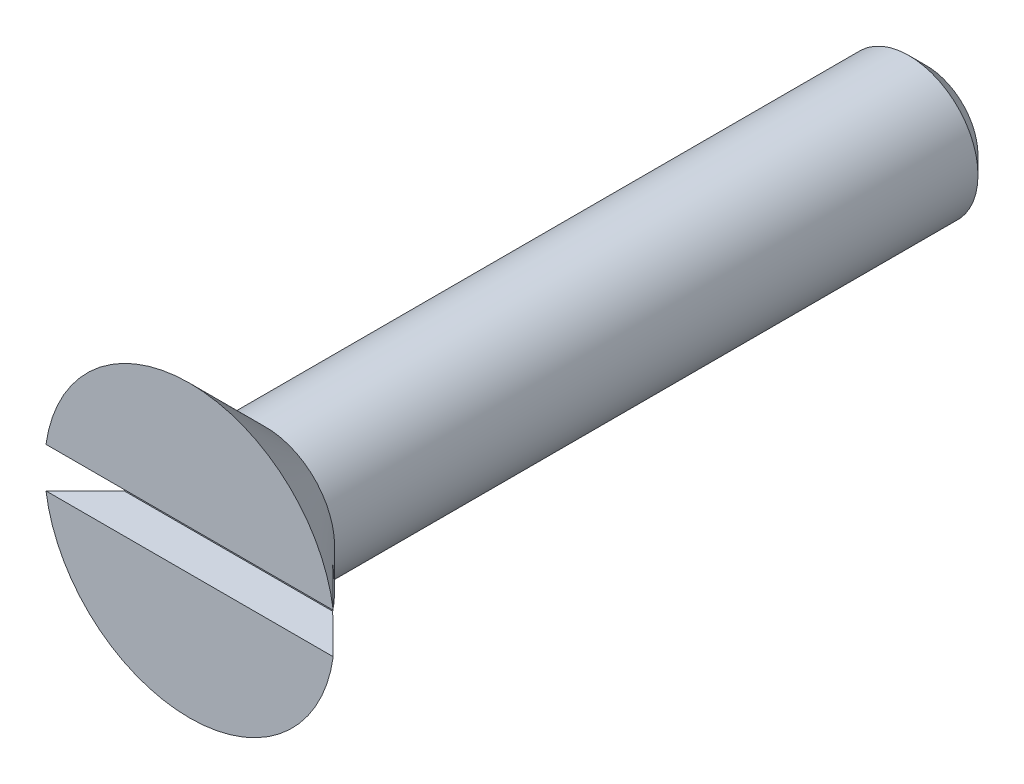
ISO-10303-21;
HEADER;
FILE_DESCRIPTION(('STEP AP214'),'2;1');
FILE_NAME('part.step','',(''),(''),'','','');
FILE_SCHEMA(('AUTOMOTIVE_DESIGN { 1 0 10303 214 1 1 1 1 }'));
ENDSEC;
DATA;
#1=APPLICATION_CONTEXT('core data for automotive mechanical design processes');
#2=APPLICATION_PROTOCOL_DEFINITION('international standard','automotive_design',2000,#1);
#3=PRODUCT_CONTEXT('',#1,'mechanical');
#4=PRODUCT('Part','Part','',(#3));
#5=PRODUCT_RELATED_PRODUCT_CATEGORY('part','',(#4));
#6=PRODUCT_DEFINITION_FORMATION('','',#4);
#7=PRODUCT_DEFINITION_CONTEXT('part definition',#1,'design');
#8=PRODUCT_DEFINITION('design','',#6,#7);
#9=PRODUCT_DEFINITION_SHAPE('','',#8);
#10=(LENGTH_UNIT() NAMED_UNIT(*) SI_UNIT(.MILLI.,.METRE.));
#11=(NAMED_UNIT(*) PLANE_ANGLE_UNIT() SI_UNIT($,.RADIAN.));
#12=(NAMED_UNIT(*) SI_UNIT($,.STERADIAN.) SOLID_ANGLE_UNIT());
#13=UNCERTAINTY_MEASURE_WITH_UNIT(LENGTH_MEASURE(1.E-05),#10,'distance_accuracy_value','');
#14=(GEOMETRIC_REPRESENTATION_CONTEXT(3) GLOBAL_UNCERTAINTY_ASSIGNED_CONTEXT((#13)) GLOBAL_UNIT_ASSIGNED_CONTEXT((#10,
#11,#12)) REPRESENTATION_CONTEXT('',''));
#15=CARTESIAN_POINT('',(0.,0.,0.));
#16=DIRECTION('',(0.,0.,1.));
#17=DIRECTION('',(1.,0.,0.));
#18=AXIS2_PLACEMENT_3D('',#15,#16,#17);
#19=CARTESIAN_POINT('',(0.,0.,1.7));
#20=DIRECTION('',(0.,0.,-1.));
#21=DIRECTION('',(-1.,0.,0.));
#22=AXIS2_PLACEMENT_3D('',#19,#20,#21);
#23=PLANE('',#22);
#24=CARTESIAN_POINT('',(0.,0.,1.7));
#25=DIRECTION('',(0.,0.,1.));
#26=DIRECTION('',(1.,0.,0.));
#27=AXIS2_PLACEMENT_3D('',#24,#25,#26);
#28=CIRCLE('',#27,3.15);
#29=CARTESIAN_POINT('',(-3.11947010724578,-0.4375,1.7));
#30=VERTEX_POINT('',#29);
#31=CARTESIAN_POINT('',(3.11947010724578,-0.4375,1.7));
#32=VERTEX_POINT('',#31);
#33=EDGE_CURVE('E102',#30,#32,#28,.T.);
#34=ORIENTED_EDGE('',*,*,#33,.T.);
#35=DIRECTION('',(1.,0.,0.));
#36=VECTOR('',#35,1.);
#37=CARTESIAN_POINT('',(-3.15,-0.4375,1.7));
#38=LINE('',#37,#36);
#39=EDGE_CURVE('E96',#30,#32,#38,.T.);
#40=ORIENTED_EDGE('',*,*,#39,.F.);
#41=EDGE_LOOP('',(#34,#40));
#42=FACE_BOUND('',#41,.T.);
#43=ADVANCED_FACE('F39',(#42),#23,.F.);
#44=CARTESIAN_POINT('',(3.11947010724578,0.4375,1.7));
#45=VERTEX_POINT('',#44);
#46=CARTESIAN_POINT('',(-3.11947010724578,0.4375,1.7));
#47=VERTEX_POINT('',#46);
#48=EDGE_CURVE('E95',#45,#47,#28,.T.);
#49=ORIENTED_EDGE('',*,*,#48,.T.);
#50=DIRECTION('',(-1.,0.,0.));
#51=VECTOR('',#50,1.);
#52=CARTESIAN_POINT('',(-3.15,0.4375,1.7));
#53=LINE('',#52,#51);
#54=EDGE_CURVE('E87',#45,#47,#53,.T.);
#55=ORIENTED_EDGE('',*,*,#54,.F.);
#56=EDGE_LOOP('',(#49,#55));
#57=FACE_BOUND('',#56,.T.);
#58=ADVANCED_FACE('F41',(#57),#23,.F.);
#59=CARTESIAN_POINT('',(0.,0.,0.0500000000000079));
#60=DIRECTION('',(0.,0.,1.));
#61=DIRECTION('',(1.,0.,0.));
#62=AXIS2_PLACEMENT_3D('',#59,#60,#61);
#63=CONICAL_SURFACE('',#62,1.5,0.785398163397451);
#64=ORIENTED_EDGE('',*,*,#33,.F.);
#65=CARTESIAN_POINT('',(-6.95069435097477,-0.4375,5.51444959854491));
#66=CARTESIAN_POINT('',(-6.71545377725601,-0.4375,5.27967721431496));
#67=CARTESIAN_POINT('',(-6.48019303350266,-0.4375,5.04492502441663));
#68=CARTESIAN_POINT('',(-6.00960192345305,-0.4375,4.57548243964187));
#69=CARTESIAN_POINT('',(-5.77427155604116,-0.4375,4.34079204588382));
#70=CARTESIAN_POINT('',(-5.30343158176121,-0.4375,3.87141438717137));
#71=CARTESIAN_POINT('',(-5.06792194077094,-0.4375,3.63672715644325));
#72=CARTESIAN_POINT('',(-4.59677017117157,-0.4375,3.16749350357989));
#73=CARTESIAN_POINT('',(-4.3611280448257,-0.4375,2.93294707917283));
#74=CARTESIAN_POINT('',(-3.87890631331682,-0.4375,2.45341460844365));
#75=CARTESIAN_POINT('',(-3.63231655090313,-0.4375,2.20843877608446));
#76=CARTESIAN_POINT('',(-3.13871112808016,-0.4375,1.71889165526523));
#77=CARTESIAN_POINT('',(-2.89169544725845,-0.4375,1.47432038736061));
#78=CARTESIAN_POINT('',(-2.52054668169718,-0.4375,1.10815678841121));
#79=CARTESIAN_POINT('',(-2.3967412827444,-0.4375,0.986232561251597));
#80=CARTESIAN_POINT('',(-2.14877789483762,-0.4375,0.74273812276414));
#81=CARTESIAN_POINT('',(-2.02461989882203,-0.4375,0.621167918626616));
#82=CARTESIAN_POINT('',(-1.77574261990939,-0.4375,0.378624419174153));
#83=CARTESIAN_POINT('',(-1.65102338979819,-0.4375,0.257651069877583));
#84=CARTESIAN_POINT('',(-1.46312840439675,-0.4375,0.0770435419685614));
#85=CARTESIAN_POINT('',(-1.40036175145822,-0.4375,0.0169840897073071));
#86=CARTESIAN_POINT('',(-1.27442762204848,-0.4375,-0.10271274659936));
#87=CARTESIAN_POINT('',(-1.21126015041921,-0.4375,-0.162350135725008));
#88=CARTESIAN_POINT('',(-1.11382173052775,-0.4375,-0.25339613639642));
#89=CARTESIAN_POINT('',(-1.07976946155462,-0.4375,-0.285038611518478));
#90=CARTESIAN_POINT('',(-1.01143604619376,-0.4375,-0.348076858100941));
#91=CARTESIAN_POINT('',(-0.977154895825766,-0.4375,-0.3794726252503));
#92=CARTESIAN_POINT('',(-0.908445877673763,-0.4375,-0.441798127970912));
#93=CARTESIAN_POINT('',(-0.874019325470927,-0.4375,-0.472729308933459));
#94=CARTESIAN_POINT('',(-0.804767226320551,-0.4375,-0.534138554654185));
#95=CARTESIAN_POINT('',(-0.7699416938768,-0.4375,-0.564616635791555));
#96=CARTESIAN_POINT('',(-0.687524321535922,-0.4375,-0.635446109424893));
#97=CARTESIAN_POINT('',(-0.63970868674946,-0.4375,-0.675541043817061));
#98=CARTESIAN_POINT('',(-0.566556991446948,-0.4375,-0.73432913801779));
#99=CARTESIAN_POINT('',(-0.54182952959947,-0.4375,-0.753777222319424));
#100=CARTESIAN_POINT('',(-0.491822543056473,-0.4375,-0.791947470581388));
#101=CARTESIAN_POINT('',(-0.466543099302396,-0.4375,-0.810669739870932));
#102=CARTESIAN_POINT('',(-0.414775435391958,-0.4375,-0.847417533943371));
#103=CARTESIAN_POINT('',(-0.388273549584466,-0.4375,-0.865423985183118));
#104=CARTESIAN_POINT('',(-0.334192522338339,-0.4375,-0.899859213763832));
#105=CARTESIAN_POINT('',(-0.306611926297403,-0.4375,-0.916285749684858));
#106=CARTESIAN_POINT('',(-0.250452865815358,-0.4375,-0.946436009532494));
#107=CARTESIAN_POINT('',(-0.221892495276722,-0.4375,-0.960192701204188));
#108=CARTESIAN_POINT('',(-0.163218417249906,-0.4375,-0.983807638318881));
#109=CARTESIAN_POINT('',(-0.133110728635988,-0.4375,-0.993679862316532));
#110=CARTESIAN_POINT('',(-0.0880223692180264,-0.4375,-1.00395141312084));
#111=CARTESIAN_POINT('',(-0.073551465305175,-0.4375,-1.00659400426285));
#112=CARTESIAN_POINT('',(-0.0444235926394925,-0.4375,-1.01048860754213));
#113=CARTESIAN_POINT('',(-0.0297666321560671,-0.4375,-1.0117406812645));
#114=CARTESIAN_POINT('',(0.0142250952761395,-0.4375,-1.01323688027924));
#115=CARTESIAN_POINT('',(0.0436649939441677,-0.4375,-1.01124128469903));
#116=CARTESIAN_POINT('',(0.101292142840405,-0.4375,-1.0018327116412));
#117=CARTESIAN_POINT('',(0.129488837077696,-0.4375,-0.994472979526124));
#118=CARTESIAN_POINT('',(0.170809309856394,-0.4375,-0.980519211556384));
#119=CARTESIAN_POINT('',(0.184454897966584,-0.4375,-0.975364865735926));
#120=CARTESIAN_POINT('',(0.211412528671322,-0.4375,-0.96425186784909));
#121=CARTESIAN_POINT('',(0.224724643745628,-0.4375,-0.958293392389047));
#122=CARTESIAN_POINT('',(0.266777045448894,-0.4375,-0.938210779497741));
#123=CARTESIAN_POINT('',(0.294921432003761,-0.4375,-0.922845882651961));
#124=CARTESIAN_POINT('',(0.350046604409141,-0.4375,-0.89013582475984));
#125=CARTESIAN_POINT('',(0.377025762743036,-0.4375,-0.87278800997322));
#126=CARTESIAN_POINT('',(0.430201279890642,-0.4375,-0.83673288612168));
#127=CARTESIAN_POINT('',(0.456394298082687,-0.4375,-0.818020690833663));
#128=CARTESIAN_POINT('',(0.50812313076528,-0.4375,-0.77970481009805));
#129=CARTESIAN_POINT('',(0.533658785434775,-0.4375,-0.760100911001922));
#130=CARTESIAN_POINT('',(0.610057648748741,-0.4375,-0.699952314625999));
#131=CARTESIAN_POINT('',(0.660169188221462,-0.4375,-0.658457053720058));
#132=CARTESIAN_POINT('',(0.759095952529052,-0.4375,-0.574228201210139));
#133=CARTESIAN_POINT('',(0.807914210937513,-0.4375,-0.531498112455194));
#134=CARTESIAN_POINT('',(0.903777928724115,-0.4375,-0.4461297183887));
#135=CARTESIAN_POINT('',(0.950838989272428,-0.4375,-0.403508906492821));
#136=CARTESIAN_POINT('',(1.04448251759101,-0.4375,-0.317745372768809));
#137=CARTESIAN_POINT('',(1.09106497765321,-0.4375,-0.274602642559246));
#138=CARTESIAN_POINT('',(1.23032604080343,-0.4375,-0.144633863624959));
#139=CARTESIAN_POINT('',(1.32250810126808,-0.4375,-0.05727648186134));
#140=CARTESIAN_POINT('',(1.50626750098789,-0.4375,0.118289223323196));
#141=CARTESIAN_POINT('',(1.59784397500925,-0.4375,0.206498447368561));
#142=CARTESIAN_POINT('',(1.78054968777642,-0.4375,0.383368131795782));
#143=CARTESIAN_POINT('',(1.8716789522241,-0.4375,0.47202856563489));
#144=CARTESIAN_POINT('',(2.0527126028453,-0.4375,0.648726833335544));
#145=CARTESIAN_POINT('',(2.14261992922196,-0.4375,0.73676165898462));
#146=CARTESIAN_POINT('',(2.32224140147481,-0.4375,0.913030831048659));
#147=CARTESIAN_POINT('',(2.41195554439885,-0.4375,1.00126518047099));
#148=CARTESIAN_POINT('',(2.68081262073546,-0.4375,1.26610037012193));
#149=CARTESIAN_POINT('',(2.85974916511933,-0.4375,1.44291065018944));
#150=CARTESIAN_POINT('',(3.36306970387667,-0.4375,1.94108895648711));
#151=CARTESIAN_POINT('',(3.68711145552849,-0.4375,2.26280243883242));
#152=CARTESIAN_POINT('',(4.33482479338633,-0.4375,2.90671341989869));
#153=CARTESIAN_POINT('',(4.65849630580628,-0.4375,3.22891099276393));
#154=CARTESIAN_POINT('',(5.31036659154146,-0.4375,3.87827901327936));
#155=CARTESIAN_POINT('',(5.63856193497032,-0.4375,4.20545290383715));
#156=CARTESIAN_POINT('',(6.29474601208318,-0.4375,4.85989136733905));
#157=CARTESIAN_POINT('',(6.6227347721014,-0.4375,5.18715591387629));
#158=CARTESIAN_POINT('',(6.95069435097477,-0.4375,5.51444959854491));
#159=B_SPLINE_CURVE_WITH_KNOTS('',3,(#65,#66,#67,#68,#69,#70,#71,#72,#73,#74,#75,#76,#77,#78,
#79,#80,#81,#82,#83,#84,#85,#86,#87,#88,#89,#90,#91,#92,#93,#94,#95,#96,#97,#98,#99,#100,#101,
#102,#103,#104,#105,#106,#107,#108,#109,#110,#111,#112,#113,#114,#115,#116,#117,#118,#119,#120,
#121,#122,#123,#124,#125,#126,#127,#128,#129,#130,#131,#132,#133,#134,#135,#136,#137,#138,#139,
#140,#141,#142,#143,#144,#145,#146,#147,#148,#149,#150,#151,#152,#153,#154,#155,#156,#157,#158),
.UNSPECIFIED.,.F.,.F.,(4,2,2,2,2,2,2,2,2,2,2,2,2,2,2,2,2,2,2,2,2,2,2,2,2,2,2,2,2,2,2,2,2,2,2,2,
2,2,2,2,2,2,2,2,2,2,4),(0.,0.997048560654659,1.99411407159498,2.9915537582241,3.98897689423789,
5.03175047299187,6.07457549937006,6.59586149567601,7.11715800663534,7.63840647212515,
7.89902218841885,8.15963476241322,8.29908714979861,8.43854196861998,8.5773812160964,
8.71621543238273,8.90338051507032,8.99774881127713,9.09210336123648,9.18818823101548,
9.28440746521176,9.37935012372772,9.473947928805,9.5180182515728,9.56208662241713,
9.64996810467844,9.73698893848584,9.78072959357587,9.82446065774542,9.92051040347212,
10.0166902318302,10.1132332446856,10.2097995119603,10.4049299988875,10.5995527867628,
10.7900231132878,10.9804965026262,11.3614846523295,11.74293313361,12.1243594294601,
12.5018522839031,12.8793508666369,13.634016533687,15.0038781067776,16.3739768056718,
17.7642265085964,19.1542294238138),.UNSPECIFIED.);
#160=CARTESIAN_POINT('',(-2.25800658767861,-0.4375,0.85));
#161=VERTEX_POINT('',#160);
#162=EDGE_CURVE('E11',#30,#161,#159,.T.);
#163=ORIENTED_EDGE('',*,*,#162,.T.);
#164=CARTESIAN_POINT('',(0.,0.,0.85));
#165=DIRECTION('',(0.,0.,1.));
#166=DIRECTION('',(1.,0.,0.));
#167=AXIS2_PLACEMENT_3D('',#164,#165,#166);
#168=CIRCLE('',#167,2.3);
#169=CARTESIAN_POINT('',(-2.25800658767861,0.4375,0.85));
#170=VERTEX_POINT('',#169);
#171=EDGE_CURVE('E105',#170,#161,#168,.T.);
#172=ORIENTED_EDGE('',*,*,#171,.F.);
#173=CARTESIAN_POINT('',(6.95069435097477,0.4375,5.51444959854491));
#174=CARTESIAN_POINT('',(6.71545377725601,0.4375,5.27967721431496));
#175=CARTESIAN_POINT('',(6.48019303350266,0.4375,5.04492502441663));
#176=CARTESIAN_POINT('',(6.00960192345305,0.4375,4.57548243964187));
#177=CARTESIAN_POINT('',(5.77427155604116,0.4375,4.34079204588382));
#178=CARTESIAN_POINT('',(5.30343158176121,0.4375,3.87141438717137));
#179=CARTESIAN_POINT('',(5.06792194077094,0.4375,3.63672715644325));
#180=CARTESIAN_POINT('',(4.59677017117157,0.4375,3.16749350357989));
#181=CARTESIAN_POINT('',(4.3611280448257,0.4375,2.93294707917283));
#182=CARTESIAN_POINT('',(3.87890631331682,0.4375,2.45341460844365));
#183=CARTESIAN_POINT('',(3.63231655090313,0.4375,2.20843877608446));
#184=CARTESIAN_POINT('',(3.13871112808016,0.4375,1.71889165526523));
#185=CARTESIAN_POINT('',(2.89169544725845,0.4375,1.47432038736061));
#186=CARTESIAN_POINT('',(2.52054668169718,0.4375,1.10815678841121));
#187=CARTESIAN_POINT('',(2.3967412827444,0.4375,0.986232561251597));
#188=CARTESIAN_POINT('',(2.14877789483762,0.4375,0.74273812276414));
#189=CARTESIAN_POINT('',(2.02461989882203,0.4375,0.621167918626616));
#190=CARTESIAN_POINT('',(1.77574261990939,0.4375,0.378624419174153));
#191=CARTESIAN_POINT('',(1.65102338979819,0.4375,0.257651069877583));
#192=CARTESIAN_POINT('',(1.46312840439675,0.4375,0.0770435419685614));
#193=CARTESIAN_POINT('',(1.40036175145822,0.4375,0.0169840897073071));
#194=CARTESIAN_POINT('',(1.27442762204848,0.4375,-0.10271274659936));
#195=CARTESIAN_POINT('',(1.21126015041921,0.4375,-0.162350135725008));
#196=CARTESIAN_POINT('',(1.11382173052775,0.4375,-0.25339613639642));
#197=CARTESIAN_POINT('',(1.07976946155462,0.4375,-0.285038611518478));
#198=CARTESIAN_POINT('',(1.01143604619376,0.4375,-0.348076858100941));
#199=CARTESIAN_POINT('',(0.977154895825766,0.4375,-0.3794726252503));
#200=CARTESIAN_POINT('',(0.908445877673763,0.4375,-0.441798127970912));
#201=CARTESIAN_POINT('',(0.874019325470927,0.4375,-0.472729308933459));
#202=CARTESIAN_POINT('',(0.804767226320551,0.4375,-0.534138554654185));
#203=CARTESIAN_POINT('',(0.7699416938768,0.4375,-0.564616635791555));
#204=CARTESIAN_POINT('',(0.687524321535922,0.4375,-0.635446109424893));
#205=CARTESIAN_POINT('',(0.63970868674946,0.4375,-0.675541043817061));
#206=CARTESIAN_POINT('',(0.566556991446948,0.4375,-0.73432913801779));
#207=CARTESIAN_POINT('',(0.54182952959947,0.4375,-0.753777222319424));
#208=CARTESIAN_POINT('',(0.491822543056473,0.4375,-0.791947470581388));
#209=CARTESIAN_POINT('',(0.466543099302396,0.4375,-0.810669739870932));
#210=CARTESIAN_POINT('',(0.414775435391958,0.4375,-0.847417533943371));
#211=CARTESIAN_POINT('',(0.388273549584466,0.4375,-0.865423985183118));
#212=CARTESIAN_POINT('',(0.334192522338339,0.4375,-0.899859213763832));
#213=CARTESIAN_POINT('',(0.306611926297403,0.4375,-0.916285749684858));
#214=CARTESIAN_POINT('',(0.250452865815358,0.4375,-0.946436009532494));
#215=CARTESIAN_POINT('',(0.221892495276722,0.4375,-0.960192701204188));
#216=CARTESIAN_POINT('',(0.163218417249906,0.4375,-0.983807638318881));
#217=CARTESIAN_POINT('',(0.133110728635988,0.4375,-0.993679862316532));
#218=CARTESIAN_POINT('',(0.0880223692180264,0.4375,-1.00395141312084));
#219=CARTESIAN_POINT('',(0.073551465305175,0.4375,-1.00659400426285));
#220=CARTESIAN_POINT('',(0.0444235926394925,0.4375,-1.01048860754213));
#221=CARTESIAN_POINT('',(0.0297666321560671,0.4375,-1.0117406812645));
#222=CARTESIAN_POINT('',(-0.0142250952761395,0.4375,-1.01323688027924));
#223=CARTESIAN_POINT('',(-0.0436649939441677,0.4375,-1.01124128469903));
#224=CARTESIAN_POINT('',(-0.101292142840405,0.4375,-1.0018327116412));
#225=CARTESIAN_POINT('',(-0.129488837077696,0.4375,-0.994472979526124));
#226=CARTESIAN_POINT('',(-0.170809309856394,0.4375,-0.980519211556384));
#227=CARTESIAN_POINT('',(-0.184454897966584,0.4375,-0.975364865735926));
#228=CARTESIAN_POINT('',(-0.211412528671322,0.4375,-0.96425186784909));
#229=CARTESIAN_POINT('',(-0.224724643745628,0.4375,-0.958293392389047));
#230=CARTESIAN_POINT('',(-0.266777045448894,0.4375,-0.938210779497741));
#231=CARTESIAN_POINT('',(-0.294921432003761,0.4375,-0.922845882651961));
#232=CARTESIAN_POINT('',(-0.350046604409141,0.4375,-0.89013582475984));
#233=CARTESIAN_POINT('',(-0.377025762743036,0.4375,-0.87278800997322));
#234=CARTESIAN_POINT('',(-0.430201279890642,0.4375,-0.83673288612168));
#235=CARTESIAN_POINT('',(-0.456394298082687,0.4375,-0.818020690833663));
#236=CARTESIAN_POINT('',(-0.50812313076528,0.4375,-0.77970481009805));
#237=CARTESIAN_POINT('',(-0.533658785434775,0.4375,-0.760100911001922));
#238=CARTESIAN_POINT('',(-0.610057648748741,0.4375,-0.699952314625999));
#239=CARTESIAN_POINT('',(-0.660169188221462,0.4375,-0.658457053720058));
#240=CARTESIAN_POINT('',(-0.759095952529052,0.4375,-0.574228201210139));
#241=CARTESIAN_POINT('',(-0.807914210937513,0.4375,-0.531498112455194));
#242=CARTESIAN_POINT('',(-0.903777928724115,0.4375,-0.4461297183887));
#243=CARTESIAN_POINT('',(-0.950838989272428,0.4375,-0.403508906492821));
#244=CARTESIAN_POINT('',(-1.04448251759101,0.4375,-0.317745372768809));
#245=CARTESIAN_POINT('',(-1.09106497765321,0.4375,-0.274602642559246));
#246=CARTESIAN_POINT('',(-1.23032604080343,0.4375,-0.144633863624959));
#247=CARTESIAN_POINT('',(-1.32250810126808,0.4375,-0.05727648186134));
#248=CARTESIAN_POINT('',(-1.50626750098789,0.4375,0.118289223323196));
#249=CARTESIAN_POINT('',(-1.59784397500925,0.4375,0.206498447368561));
#250=CARTESIAN_POINT('',(-1.78054968777642,0.4375,0.383368131795782));
#251=CARTESIAN_POINT('',(-1.8716789522241,0.4375,0.47202856563489));
#252=CARTESIAN_POINT('',(-2.0527126028453,0.4375,0.648726833335544));
#253=CARTESIAN_POINT('',(-2.14261992922196,0.4375,0.73676165898462));
#254=CARTESIAN_POINT('',(-2.32224140147481,0.4375,0.913030831048659));
#255=CARTESIAN_POINT('',(-2.41195554439885,0.4375,1.00126518047099));
#256=CARTESIAN_POINT('',(-2.68081262073546,0.4375,1.26610037012193));
#257=CARTESIAN_POINT('',(-2.85974916511933,0.4375,1.44291065018944));
#258=CARTESIAN_POINT('',(-3.36306970387667,0.4375,1.94108895648711));
#259=CARTESIAN_POINT('',(-3.68711145552849,0.4375,2.26280243883242));
#260=CARTESIAN_POINT('',(-4.33482479338633,0.4375,2.90671341989869));
#261=CARTESIAN_POINT('',(-4.65849630580628,0.4375,3.22891099276393));
#262=CARTESIAN_POINT('',(-5.31036659154146,0.4375,3.87827901327936));
#263=CARTESIAN_POINT('',(-5.63856193497032,0.4375,4.20545290383715));
#264=CARTESIAN_POINT('',(-6.29474601208318,0.4375,4.85989136733905));
#265=CARTESIAN_POINT('',(-6.6227347721014,0.4375,5.18715591387629));
#266=CARTESIAN_POINT('',(-6.95069435097477,0.4375,5.51444959854491));
#267=B_SPLINE_CURVE_WITH_KNOTS('',3,(#173,#174,#175,#176,#177,#178,#179,#180,#181,#182,#183,
#184,#185,#186,#187,#188,#189,#190,#191,#192,#193,#194,#195,#196,#197,#198,#199,#200,#201,#202,
#203,#204,#205,#206,#207,#208,#209,#210,#211,#212,#213,#214,#215,#216,#217,#218,#219,#220,#221,
#222,#223,#224,#225,#226,#227,#228,#229,#230,#231,#232,#233,#234,#235,#236,#237,#238,#239,#240,
#241,#242,#243,#244,#245,#246,#247,#248,#249,#250,#251,#252,#253,#254,#255,#256,#257,#258,#259,
#260,#261,#262,#263,#264,#265,#266),.UNSPECIFIED.,.F.,.F.,(4,2,2,2,2,2,2,2,2,2,2,2,2,2,2,2,2,2,
2,2,2,2,2,2,2,2,2,2,2,2,2,2,2,2,2,2,2,2,2,2,2,2,2,2,2,2,4),(0.,0.997048560654659,
1.99411407159498,2.9915537582241,3.98897689423789,5.03175047299187,6.07457549937006,
6.59586149567601,7.11715800663534,7.63840647212515,7.89902218841885,8.15963476241322,
8.29908714979861,8.43854196861998,8.5773812160964,8.71621543238273,8.90338051507032,
8.99774881127713,9.09210336123648,9.18818823101548,9.28440746521176,9.37935012372772,
9.473947928805,9.5180182515728,9.56208662241713,9.64996810467844,9.73698893848584,
9.78072959357587,9.82446065774542,9.92051040347212,10.0166902318302,10.1132332446856,
10.2097995119603,10.4049299988875,10.5995527867628,10.7900231132878,10.9804965026262,
11.3614846523295,11.74293313361,12.1243594294601,12.5018522839031,12.8793508666369,
13.634016533687,15.0038781067776,16.3739768056718,17.7642265085964,19.1542294238138),.UNSPECIFIED.);
#268=EDGE_CURVE('E53',#170,#47,#267,.T.);
#269=ORIENTED_EDGE('',*,*,#268,.T.);
#270=ORIENTED_EDGE('',*,*,#48,.F.);
#271=CARTESIAN_POINT('',(2.25800658767861,0.4375,0.85));
#272=VERTEX_POINT('',#271);
#273=EDGE_CURVE('E84',#45,#272,#267,.T.);
#274=ORIENTED_EDGE('',*,*,#273,.T.);
#275=CARTESIAN_POINT('',(2.25800658767861,-0.4375,0.85));
#276=VERTEX_POINT('',#275);
#277=EDGE_CURVE('E92',#276,#272,#168,.T.);
#278=ORIENTED_EDGE('',*,*,#277,.F.);
#279=EDGE_CURVE('E43',#276,#32,#159,.T.);
#280=ORIENTED_EDGE('',*,*,#279,.T.);
#281=EDGE_LOOP('',(#64,#163,#172,#269,#270,#274,#278,#280));
#282=FACE_BOUND('',#281,.T.);
#283=CARTESIAN_POINT('',(0.,0.,0.0500000000000079));
#284=DIRECTION('',(0.,0.,1.));
#285=DIRECTION('',(1.,0.,0.));
#286=AXIS2_PLACEMENT_3D('',#283,#284,#285);
#287=CIRCLE('',#286,1.5);
#288=CARTESIAN_POINT('',(1.5,0.,0.0500000000000079));
#289=VERTEX_POINT('',#288);
#290=EDGE_CURVE('E107',#289,#289,#287,.T.);
#291=ORIENTED_EDGE('',*,*,#290,.T.);
#292=EDGE_LOOP('',(#291));
#293=FACE_BOUND('',#292,.T.);
#294=ADVANCED_FACE('F99',(#282,#293),#63,.T.);
#295=CARTESIAN_POINT('',(0.,0.,1.7));
#296=DIRECTION('',(0.,0.,1.));
#297=DIRECTION('',(1.,0.,0.));
#298=AXIS2_PLACEMENT_3D('',#295,#296,#297);
#299=CYLINDRICAL_SURFACE('',#298,1.5);
#300=ORIENTED_EDGE('',*,*,#290,.F.);
#301=EDGE_LOOP('',(#300));
#302=FACE_BOUND('',#301,.T.);
#303=CARTESIAN_POINT('',(0.,0.,-13.925));
#304=DIRECTION('',(0.,0.,1.));
#305=DIRECTION('',(1.,0.,0.));
#306=AXIS2_PLACEMENT_3D('',#303,#304,#305);
#307=CIRCLE('',#306,1.5);
#308=CARTESIAN_POINT('',(1.5,0.,-13.925));
#309=VERTEX_POINT('',#308);
#310=EDGE_CURVE('E150',#309,#309,#307,.T.);
#311=ORIENTED_EDGE('',*,*,#310,.T.);
#312=EDGE_LOOP('',(#311));
#313=FACE_BOUND('',#312,.T.);
#314=ADVANCED_FACE('F130',(#302,#313),#299,.T.);
#315=CARTESIAN_POINT('',(0.,0.,-14.3));
#316=DIRECTION('',(0.,0.,1.));
#317=DIRECTION('',(1.,0.,0.));
#318=AXIS2_PLACEMENT_3D('',#315,#316,#317);
#319=CONICAL_SURFACE('',#318,1.125,0.785398163397448);
#320=ORIENTED_EDGE('',*,*,#310,.F.);
#321=EDGE_LOOP('',(#320));
#322=FACE_BOUND('',#321,.T.);
#323=CARTESIAN_POINT('',(0.,0.,-14.3));
#324=DIRECTION('',(0.,0.,1.));
#325=DIRECTION('',(1.,0.,0.));
#326=AXIS2_PLACEMENT_3D('',#323,#324,#325);
#327=CIRCLE('',#326,1.125);
#328=CARTESIAN_POINT('',(1.125,0.,-14.3));
#329=VERTEX_POINT('',#328);
#330=EDGE_CURVE('E147',#329,#329,#327,.T.);
#331=ORIENTED_EDGE('',*,*,#330,.T.);
#332=EDGE_LOOP('',(#331));
#333=FACE_BOUND('',#332,.T.);
#334=ADVANCED_FACE('F127',(#322,#333),#319,.T.);
#335=CARTESIAN_POINT('',(0.,1.125,-14.3));
#336=DIRECTION('',(0.,0.,1.));
#337=DIRECTION('',(1.,0.,0.));
#338=AXIS2_PLACEMENT_3D('',#335,#336,#337);
#339=PLANE('',#338);
#340=ORIENTED_EDGE('',*,*,#330,.F.);
#341=EDGE_LOOP('',(#340));
#342=FACE_BOUND('',#341,.T.);
#343=ADVANCED_FACE('F124',(#342),#339,.F.);
#344=CARTESIAN_POINT('',(-3.15,-0.4375,0.85));
#345=DIRECTION('',(0.,-1.,0.));
#346=DIRECTION('',(0.,0.,-1.));
#347=AXIS2_PLACEMENT_3D('',#344,#345,#346);
#348=PLANE('',#347);
#349=ORIENTED_EDGE('',*,*,#39,.T.);
#350=ORIENTED_EDGE('',*,*,#279,.F.);
#351=DIRECTION('',(1.,0.,0.));
#352=VECTOR('',#351,1.);
#353=CARTESIAN_POINT('',(-3.15,-0.4375,0.85));
#354=LINE('',#353,#352);
#355=EDGE_CURVE('E60',#161,#276,#354,.T.);
#356=ORIENTED_EDGE('',*,*,#355,.F.);
#357=ORIENTED_EDGE('',*,*,#162,.F.);
#358=EDGE_LOOP('',(#349,#350,#356,#357));
#359=FACE_BOUND('',#358,.T.);
#360=ADVANCED_FACE('F121',(#359),#348,.F.);
#361=CARTESIAN_POINT('',(-3.15,0.4375,0.85));
#362=DIRECTION('',(0.,1.,0.));
#363=DIRECTION('',(0.,0.,1.));
#364=AXIS2_PLACEMENT_3D('',#361,#362,#363);
#365=PLANE('',#364);
#366=ORIENTED_EDGE('',*,*,#54,.T.);
#367=ORIENTED_EDGE('',*,*,#268,.F.);
#368=DIRECTION('',(-1.,0.,0.));
#369=VECTOR('',#368,1.);
#370=CARTESIAN_POINT('',(-3.15,0.4375,0.85));
#371=LINE('',#370,#369);
#372=EDGE_CURVE('E88',#272,#170,#371,.T.);
#373=ORIENTED_EDGE('',*,*,#372,.F.);
#374=ORIENTED_EDGE('',*,*,#273,.F.);
#375=EDGE_LOOP('',(#366,#367,#373,#374));
#376=FACE_BOUND('',#375,.T.);
#377=ADVANCED_FACE('F86',(#376),#365,.F.);
#378=CARTESIAN_POINT('',(0.,0.,0.85));
#379=DIRECTION('',(0.,0.,1.));
#380=DIRECTION('',(1.,0.,0.));
#381=AXIS2_PLACEMENT_3D('',#378,#379,#380);
#382=PLANE('',#381);
#383=ORIENTED_EDGE('',*,*,#171,.T.);
#384=ORIENTED_EDGE('',*,*,#355,.T.);
#385=ORIENTED_EDGE('',*,*,#277,.T.);
#386=ORIENTED_EDGE('',*,*,#372,.T.);
#387=EDGE_LOOP('',(#383,#384,#385,#386));
#388=FACE_BOUND('',#387,.T.);
#389=ADVANCED_FACE('F120',(#388),#382,.T.);
#390=CLOSED_SHELL('',(#43,#58,#294,#314,#334,#343,#360,#377,#389));
#391=MANIFOLD_SOLID_BREP('B2',#390);
#392=ADVANCED_BREP_SHAPE_REPRESENTATION('',(#18,#391),#14);
#393=SHAPE_DEFINITION_REPRESENTATION(#9,#392);
ENDSEC;
END-ISO-10303-21;
